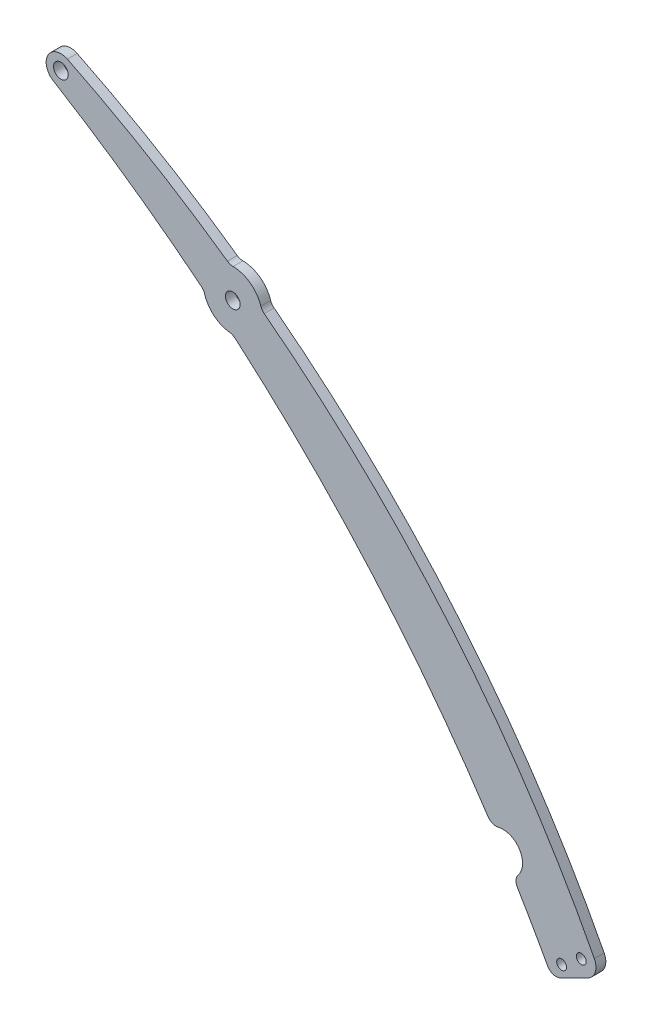
ISO-10303-21;
HEADER;
FILE_DESCRIPTION(('STEP AP214'),'2;1');
FILE_NAME('part.step','',(''),(''),'','','');
FILE_SCHEMA(('AUTOMOTIVE_DESIGN { 1 0 10303 214 1 1 1 1 }'));
ENDSEC;
DATA;
#1=APPLICATION_CONTEXT('core data for automotive mechanical design processes');
#2=APPLICATION_PROTOCOL_DEFINITION('international standard','automotive_design',2000,#1);
#3=PRODUCT_CONTEXT('',#1,'mechanical');
#4=PRODUCT('Part','Part','',(#3));
#5=PRODUCT_RELATED_PRODUCT_CATEGORY('part','',(#4));
#6=PRODUCT_DEFINITION_FORMATION('','',#4);
#7=PRODUCT_DEFINITION_CONTEXT('part definition',#1,'design');
#8=PRODUCT_DEFINITION('design','',#6,#7);
#9=PRODUCT_DEFINITION_SHAPE('','',#8);
#10=(LENGTH_UNIT() NAMED_UNIT(*) SI_UNIT(.MILLI.,.METRE.));
#11=(NAMED_UNIT(*) PLANE_ANGLE_UNIT() SI_UNIT($,.RADIAN.));
#12=(NAMED_UNIT(*) SI_UNIT($,.STERADIAN.) SOLID_ANGLE_UNIT());
#13=UNCERTAINTY_MEASURE_WITH_UNIT(LENGTH_MEASURE(1.E-05),#10,'distance_accuracy_value','');
#14=(GEOMETRIC_REPRESENTATION_CONTEXT(3) GLOBAL_UNCERTAINTY_ASSIGNED_CONTEXT((#13)) GLOBAL_UNIT_ASSIGNED_CONTEXT((#10,
#11,#12)) REPRESENTATION_CONTEXT('',''));
#15=CARTESIAN_POINT('',(0.,0.,0.));
#16=DIRECTION('',(0.,0.,1.));
#17=DIRECTION('',(1.,0.,0.));
#18=AXIS2_PLACEMENT_3D('',#15,#16,#17);
#19=CARTESIAN_POINT('',(-104.441646141028,-212.746192801075,2.));
#20=DIRECTION('',(0.,0.,-1.));
#21=DIRECTION('',(-1.,0.,0.));
#22=AXIS2_PLACEMENT_3D('',#19,#20,#21);
#23=PLANE('',#22);
#24=CARTESIAN_POINT('',(-104.441646141028,-212.746192801075,2.));
#25=DIRECTION('',(0.,0.,1.));
#26=DIRECTION('',(-1.,0.,0.));
#27=AXIS2_PLACEMENT_3D('',#24,#25,#26);
#28=CIRCLE('',#27,240.);
#29=CARTESIAN_POINT('',(33.906457746994,-16.6344844545589,2.));
#30=VERTEX_POINT('',#29);
#31=CARTESIAN_POINT('',(1.32204615368389,2.69298978229209,2.));
#32=VERTEX_POINT('',#31);
#33=EDGE_CURVE('E232',#30,#32,#28,.T.);
#34=ORIENTED_EDGE('',*,*,#33,.T.);
#35=CARTESIAN_POINT('',(0.,0.,2.));
#36=DIRECTION('',(0.,0.,1.));
#37=DIRECTION('',(1.,0.,0.));
#38=AXIS2_PLACEMENT_3D('',#35,#36,#37);
#39=CIRCLE('',#38,3.);
#40=CARTESIAN_POINT('',(-1.55871058061747,-2.56328330971649,2.));
#41=VERTEX_POINT('',#40);
#42=EDGE_CURVE('E133',#32,#41,#39,.T.);
#43=ORIENTED_EDGE('',*,*,#42,.T.);
#44=CARTESIAN_POINT('',(-147.038364771582,-241.803058883256,2.));
#45=DIRECTION('',(0.,0.,-1.));
#46=DIRECTION('',(-1.,0.,0.));
#47=AXIS2_PLACEMENT_3D('',#44,#45,#46);
#48=CIRCLE('',#47,280.);
#49=CARTESIAN_POINT('',(28.589143834394,-23.7320194927445,2.));
#50=VERTEX_POINT('',#49);
#51=EDGE_CURVE('E279',#41,#50,#48,.T.);
#52=ORIENTED_EDGE('',*,*,#51,.T.);
#53=CARTESIAN_POINT('',(27.3346616300656,-25.2896697741052,2.));
#54=DIRECTION('',(0.,0.,-1.));
#55=DIRECTION('',(-1.,0.,0.));
#56=AXIS2_PLACEMENT_3D('',#53,#54,#55);
#57=CIRCLE('',#56,2.);
#58=CARTESIAN_POINT('',(29.2509962225486,-24.7172523305791,2.));
#59=VERTEX_POINT('',#58);
#60=EDGE_CURVE('E299',#50,#59,#57,.T.);
#61=ORIENTED_EDGE('',*,*,#60,.T.);
#62=CARTESIAN_POINT('',(35.,-23.,2.));
#63=DIRECTION('',(0.,0.,1.));
#64=DIRECTION('',(1.,0.,0.));
#65=AXIS2_PLACEMENT_3D('',#62,#63,#64);
#66=CIRCLE('',#65,6.00000000000246);
#67=CARTESIAN_POINT('',(34.3571848035066,-28.9654663374448,2.));
#68=VERTEX_POINT('',#67);
#69=EDGE_CURVE('E294',#59,#68,#66,.T.);
#70=ORIENTED_EDGE('',*,*,#69,.T.);
#71=CARTESIAN_POINT('',(34.1429130713422,-30.9539551165922,2.));
#72=DIRECTION('',(0.,0.,-1.));
#73=DIRECTION('',(1.,0.,0.));
#74=AXIS2_PLACEMENT_3D('',#71,#72,#73);
#75=CIRCLE('',#74,2.);
#76=CARTESIAN_POINT('',(35.4463755018668,-29.4370550894939,2.));
#77=VERTEX_POINT('',#76);
#78=EDGE_CURVE('E298',#68,#77,#75,.T.);
#79=ORIENTED_EDGE('',*,*,#78,.T.);
#80=CARTESIAN_POINT('',(-147.038364771582,-241.803058883256,2.));
#81=DIRECTION('',(0.,0.,-1.));
#82=DIRECTION('',(-1.,0.,0.));
#83=AXIS2_PLACEMENT_3D('',#80,#81,#82);
#84=CIRCLE('',#83,280.);
#85=CARTESIAN_POINT('',(86.9517610214961,-88.0219773701524,2.));
#86=VERTEX_POINT('',#85);
#87=EDGE_CURVE('E300',#77,#86,#84,.T.);
#88=ORIENTED_EDGE('',*,*,#87,.T.);
#89=CARTESIAN_POINT('',(88.6231190628752,-86.9235410736303,2.));
#90=DIRECTION('',(0.,0.,1.));
#91=DIRECTION('',(-1.,0.,0.));
#92=AXIS2_PLACEMENT_3D('',#89,#90,#91);
#93=CIRCLE('',#92,2.);
#94=CARTESIAN_POINT('',(89.0820793752501,-88.8701677537271,2.));
#95=VERTEX_POINT('',#94);
#96=EDGE_CURVE('E304',#86,#95,#93,.T.);
#97=ORIENTED_EDGE('',*,*,#96,.T.);
#98=CARTESIAN_POINT('',(90.,-92.7634211139207,2.));
#99=DIRECTION('',(0.,0.,-1.));
#100=DIRECTION('',(-1.,0.,0.));
#101=AXIS2_PLACEMENT_3D('',#98,#99,#100);
#102=CIRCLE('',#101,3.99999999999999);
#103=CARTESIAN_POINT('',(93.1109286253578,-95.2778043559762,2.));
#104=VERTEX_POINT('',#103);
#105=EDGE_CURVE('E307',#95,#104,#102,.T.);
#106=ORIENTED_EDGE('',*,*,#105,.T.);
#107=CARTESIAN_POINT('',(94.6663929380367,-96.5349959770039,2.));
#108=DIRECTION('',(0.,0.,1.));
#109=DIRECTION('',(1.,0.,0.));
#110=AXIS2_PLACEMENT_3D('',#107,#108,#109);
#111=CIRCLE('',#110,2.);
#112=CARTESIAN_POINT('',(92.9521747982521,-97.5652659266937,2.));
#113=VERTEX_POINT('',#112);
#114=EDGE_CURVE('E310',#104,#113,#111,.T.);
#115=ORIENTED_EDGE('',*,*,#114,.T.);
#116=CARTESIAN_POINT('',(-147.038364771582,-241.803058883256,2.));
#117=DIRECTION('',(0.,0.,-1.));
#118=DIRECTION('',(-1.,0.,0.));
#119=AXIS2_PLACEMENT_3D('',#116,#117,#118);
#120=CIRCLE('',#119,280.);
#121=CARTESIAN_POINT('',(99.0817764541614,-108.293223728611,2.));
#122=VERTEX_POINT('',#121);
#123=EDGE_CURVE('E313',#113,#122,#120,.T.);
#124=ORIENTED_EDGE('',*,*,#123,.T.);
#125=CARTESIAN_POINT('',(100.839777462917,-107.339582048935,2.));
#126=DIRECTION('',(0.,0.,1.));
#127=DIRECTION('',(1.,0.,0.));
#128=AXIS2_PLACEMENT_3D('',#125,#126,#127);
#129=CIRCLE('',#128,1.99999999999999);
#130=CARTESIAN_POINT('',(101.737876551127,-109.126595766777,2.));
#131=VERTEX_POINT('',#130);
#132=EDGE_CURVE('E311',#122,#131,#129,.T.);
#133=ORIENTED_EDGE('',*,*,#132,.T.);
#134=DIRECTION('',(0.893506858920948,0.449049544105348,0.));
#135=VECTOR('',#134,1.);
#136=CARTESIAN_POINT('',(107.302513423485,-106.329977446844,2.));
#137=LINE('',#136,#135);
#138=CARTESIAN_POINT('',(107.302513423485,-106.329977446844,2.));
#139=VERTEX_POINT('',#138);
#140=EDGE_CURVE('E312',#131,#139,#137,.T.);
#141=ORIENTED_EDGE('',*,*,#140,.T.);
#142=CARTESIAN_POINT('',(105.955364791169,-103.649456870081,2.));
#143=DIRECTION('',(0.,0.,1.));
#144=DIRECTION('',(-1.,0.,0.));
#145=AXIS2_PLACEMENT_3D('',#142,#143,#144);
#146=CIRCLE('',#145,2.99999999999999);
#147=CARTESIAN_POINT('',(108.618618094108,-102.268485529183,2.));
#148=VERTEX_POINT('',#147);
#149=EDGE_CURVE('E320',#139,#148,#146,.T.);
#150=ORIENTED_EDGE('',*,*,#149,.T.);
#151=CARTESIAN_POINT('',(-104.441646141028,-212.746192801075,2.));
#152=DIRECTION('',(0.,0.,1.));
#153=DIRECTION('',(-1.,0.,0.));
#154=AXIS2_PLACEMENT_3D('',#151,#152,#153);
#155=CIRCLE('',#154,240.);
#156=CARTESIAN_POINT('',(41.4015934450764,-22.1425478542113,2.));
#157=VERTEX_POINT('',#156);
#158=EDGE_CURVE('E179',#148,#157,#155,.T.);
#159=ORIENTED_EDGE('',*,*,#158,.T.);
#160=CARTESIAN_POINT('',(42.6169537749606,-20.5541841463207,2.));
#161=DIRECTION('',(0.,0.,-1.));
#162=DIRECTION('',(-1.,0.,0.));
#163=AXIS2_PLACEMENT_3D('',#160,#161,#162);
#164=CIRCLE('',#163,2.);
#165=CARTESIAN_POINT('',(40.7127153312204,-21.1656381097406,2.));
#166=VERTEX_POINT('',#165);
#167=EDGE_CURVE('E175',#157,#166,#164,.T.);
#168=ORIENTED_EDGE('',*,*,#167,.T.);
#169=CARTESIAN_POINT('',(35.,-23.,2.));
#170=DIRECTION('',(0.,0.,1.));
#171=DIRECTION('',(1.,0.,0.));
#172=AXIS2_PLACEMENT_3D('',#169,#170,#171);
#173=CIRCLE('',#172,5.99999999999969);
#174=CARTESIAN_POINT('',(35.0445189595456,-17.0001651637535,2.));
#175=VERTEX_POINT('',#174);
#176=EDGE_CURVE('E177',#166,#175,#173,.T.);
#177=ORIENTED_EDGE('',*,*,#176,.T.);
#178=CARTESIAN_POINT('',(35.0593586127275,-15.0002202183379,2.));
#179=DIRECTION('',(0.,0.,-1.));
#180=DIRECTION('',(1.,0.,0.));
#181=AXIS2_PLACEMENT_3D('',#178,#179,#180);
#182=CIRCLE('',#181,2.);
#183=EDGE_CURVE('E59',#175,#30,#182,.T.);
#184=ORIENTED_EDGE('',*,*,#183,.T.);
#185=EDGE_LOOP('',(#34,#43,#52,#61,#70,#79,#88,#97,#106,#115,#124,#133,#141,#150,#159,#168,#177,#184));
#186=FACE_BOUND('',#185,.T.);
#187=CARTESIAN_POINT('',(0.,0.,2.));
#188=DIRECTION('',(0.,0.,1.));
#189=DIRECTION('',(1.,0.,0.));
#190=AXIS2_PLACEMENT_3D('',#187,#188,#189);
#191=CIRCLE('',#190,1.5);
#192=CARTESIAN_POINT('',(1.5,0.,2.));
#193=VERTEX_POINT('',#192);
#194=EDGE_CURVE('E205',#193,#193,#191,.T.);
#195=ORIENTED_EDGE('',*,*,#194,.F.);
#196=EDGE_LOOP('',(#195));
#197=FACE_BOUND('',#196,.T.);
#198=CARTESIAN_POINT('',(101.955364791169,-106.649456870081,2.));
#199=DIRECTION('',(0.,0.,1.));
#200=DIRECTION('',(1.,0.,0.));
#201=AXIS2_PLACEMENT_3D('',#198,#199,#200);
#202=CIRCLE('',#201,0.999999999999998);
#203=CARTESIAN_POINT('',(102.955364791169,-106.649456870081,2.));
#204=VERTEX_POINT('',#203);
#205=EDGE_CURVE('E381',#204,#204,#202,.T.);
#206=ORIENTED_EDGE('',*,*,#205,.F.);
#207=EDGE_LOOP('',(#206));
#208=FACE_BOUND('',#207,.T.);
#209=CARTESIAN_POINT('',(35.,-23.,2.));
#210=DIRECTION('',(0.,0.,1.));
#211=DIRECTION('',(1.,0.,0.));
#212=AXIS2_PLACEMENT_3D('',#209,#210,#211);
#213=CIRCLE('',#212,1.5);
#214=CARTESIAN_POINT('',(36.5,-23.,2.));
#215=VERTEX_POINT('',#214);
#216=EDGE_CURVE('E374',#215,#215,#213,.T.);
#217=ORIENTED_EDGE('',*,*,#216,.F.);
#218=EDGE_LOOP('',(#217));
#219=FACE_BOUND('',#218,.T.);
#220=CARTESIAN_POINT('',(105.955364791169,-103.649456870081,2.));
#221=DIRECTION('',(0.,0.,1.));
#222=DIRECTION('',(1.,0.,0.));
#223=AXIS2_PLACEMENT_3D('',#220,#221,#222);
#224=CIRCLE('',#223,0.999999999999998);
#225=CARTESIAN_POINT('',(106.955364791169,-103.649456870081,2.));
#226=VERTEX_POINT('',#225);
#227=EDGE_CURVE('E368',#226,#226,#224,.T.);
#228=ORIENTED_EDGE('',*,*,#227,.F.);
#229=EDGE_LOOP('',(#228));
#230=FACE_BOUND('',#229,.T.);
#231=ADVANCED_FACE('F41',(#186,#197,#208,#219,#230),#23,.F.);
#232=CARTESIAN_POINT('',(-104.441646141028,-212.746192801075,0.));
#233=DIRECTION('',(0.,0.,-1.));
#234=DIRECTION('',(-1.,0.,0.));
#235=AXIS2_PLACEMENT_3D('',#232,#233,#234);
#236=PLANE('',#235);
#237=CARTESIAN_POINT('',(35.,-23.,0.));
#238=DIRECTION('',(0.,0.,1.));
#239=DIRECTION('',(1.,0.,0.));
#240=AXIS2_PLACEMENT_3D('',#237,#238,#239);
#241=CIRCLE('',#240,1.5);
#242=CARTESIAN_POINT('',(36.5,-23.,0.));
#243=VERTEX_POINT('',#242);
#244=EDGE_CURVE('E375',#243,#243,#241,.T.);
#245=ORIENTED_EDGE('',*,*,#244,.T.);
#246=EDGE_LOOP('',(#245));
#247=FACE_BOUND('',#246,.T.);
#248=CARTESIAN_POINT('',(0.,0.,0.));
#249=DIRECTION('',(0.,0.,1.));
#250=DIRECTION('',(1.,0.,0.));
#251=AXIS2_PLACEMENT_3D('',#248,#249,#250);
#252=CIRCLE('',#251,1.5);
#253=CARTESIAN_POINT('',(1.5,0.,0.));
#254=VERTEX_POINT('',#253);
#255=EDGE_CURVE('E383',#254,#254,#252,.T.);
#256=ORIENTED_EDGE('',*,*,#255,.T.);
#257=EDGE_LOOP('',(#256));
#258=FACE_BOUND('',#257,.T.);
#259=CARTESIAN_POINT('',(-104.441646141028,-212.746192801075,0.));
#260=DIRECTION('',(0.,0.,1.));
#261=DIRECTION('',(-1.,0.,0.));
#262=AXIS2_PLACEMENT_3D('',#259,#260,#261);
#263=CIRCLE('',#262,240.);
#264=CARTESIAN_POINT('',(33.906457746994,-16.6344844545589,0.));
#265=VERTEX_POINT('',#264);
#266=CARTESIAN_POINT('',(1.32204615368389,2.69298978229209,0.));
#267=VERTEX_POINT('',#266);
#268=EDGE_CURVE('E196',#265,#267,#263,.T.);
#269=ORIENTED_EDGE('',*,*,#268,.F.);
#270=CARTESIAN_POINT('',(35.0593586127275,-15.0002202183379,0.));
#271=DIRECTION('',(0.,0.,-1.));
#272=DIRECTION('',(1.,0.,0.));
#273=AXIS2_PLACEMENT_3D('',#270,#271,#272);
#274=CIRCLE('',#273,2.);
#275=CARTESIAN_POINT('',(35.0445189595456,-17.0001651637535,0.));
#276=VERTEX_POINT('',#275);
#277=EDGE_CURVE('E122',#276,#265,#274,.T.);
#278=ORIENTED_EDGE('',*,*,#277,.F.);
#279=CARTESIAN_POINT('',(35.,-23.,0.));
#280=DIRECTION('',(0.,0.,1.));
#281=DIRECTION('',(1.,0.,0.));
#282=AXIS2_PLACEMENT_3D('',#279,#280,#281);
#283=CIRCLE('',#282,5.99999999999969);
#284=CARTESIAN_POINT('',(40.7127153312204,-21.1656381097406,0.));
#285=VERTEX_POINT('',#284);
#286=EDGE_CURVE('E119',#285,#276,#283,.T.);
#287=ORIENTED_EDGE('',*,*,#286,.F.);
#288=CARTESIAN_POINT('',(42.6169537749606,-20.5541841463207,0.));
#289=DIRECTION('',(0.,0.,-1.));
#290=DIRECTION('',(-1.,0.,0.));
#291=AXIS2_PLACEMENT_3D('',#288,#289,#290);
#292=CIRCLE('',#291,2.);
#293=CARTESIAN_POINT('',(41.4015934450764,-22.1425478542113,0.));
#294=VERTEX_POINT('',#293);
#295=EDGE_CURVE('E187',#294,#285,#292,.T.);
#296=ORIENTED_EDGE('',*,*,#295,.F.);
#297=CARTESIAN_POINT('',(-104.441646141028,-212.746192801075,0.));
#298=DIRECTION('',(0.,0.,1.));
#299=DIRECTION('',(-1.,0.,0.));
#300=AXIS2_PLACEMENT_3D('',#297,#298,#299);
#301=CIRCLE('',#300,240.);
#302=CARTESIAN_POINT('',(108.618618094108,-102.268485529183,0.));
#303=VERTEX_POINT('',#302);
#304=EDGE_CURVE('E227',#303,#294,#301,.T.);
#305=ORIENTED_EDGE('',*,*,#304,.F.);
#306=CARTESIAN_POINT('',(105.955364791169,-103.649456870081,0.));
#307=DIRECTION('',(0.,0.,1.));
#308=DIRECTION('',(-1.,0.,0.));
#309=AXIS2_PLACEMENT_3D('',#306,#307,#308);
#310=CIRCLE('',#309,2.99999999999999);
#311=CARTESIAN_POINT('',(107.302513423485,-106.329977446844,0.));
#312=VERTEX_POINT('',#311);
#313=EDGE_CURVE('E228',#312,#303,#310,.T.);
#314=ORIENTED_EDGE('',*,*,#313,.F.);
#315=DIRECTION('',(0.893506858920948,0.449049544105348,0.));
#316=VECTOR('',#315,1.);
#317=CARTESIAN_POINT('',(107.302513423485,-106.329977446844,0.));
#318=LINE('',#317,#316);
#319=CARTESIAN_POINT('',(101.737876551127,-109.126595766777,0.));
#320=VERTEX_POINT('',#319);
#321=EDGE_CURVE('E221',#320,#312,#318,.T.);
#322=ORIENTED_EDGE('',*,*,#321,.F.);
#323=CARTESIAN_POINT('',(100.839777462917,-107.339582048935,0.));
#324=DIRECTION('',(0.,0.,1.));
#325=DIRECTION('',(1.,0.,0.));
#326=AXIS2_PLACEMENT_3D('',#323,#324,#325);
#327=CIRCLE('',#326,1.99999999999999);
#328=CARTESIAN_POINT('',(99.0817764541614,-108.293223728611,0.));
#329=VERTEX_POINT('',#328);
#330=EDGE_CURVE('E225',#329,#320,#327,.T.);
#331=ORIENTED_EDGE('',*,*,#330,.F.);
#332=CARTESIAN_POINT('',(-147.038364771582,-241.803058883256,0.));
#333=DIRECTION('',(0.,0.,-1.));
#334=DIRECTION('',(-1.,0.,0.));
#335=AXIS2_PLACEMENT_3D('',#332,#333,#334);
#336=CIRCLE('',#335,280.);
#337=CARTESIAN_POINT('',(92.9521747982521,-97.5652659266937,0.));
#338=VERTEX_POINT('',#337);
#339=EDGE_CURVE('E219',#338,#329,#336,.T.);
#340=ORIENTED_EDGE('',*,*,#339,.F.);
#341=CARTESIAN_POINT('',(94.6663929380367,-96.5349959770039,0.));
#342=DIRECTION('',(0.,0.,1.));
#343=DIRECTION('',(1.,0.,0.));
#344=AXIS2_PLACEMENT_3D('',#341,#342,#343);
#345=CIRCLE('',#344,2.);
#346=CARTESIAN_POINT('',(93.1109286253578,-95.2778043559762,0.));
#347=VERTEX_POINT('',#346);
#348=EDGE_CURVE('E217',#347,#338,#345,.T.);
#349=ORIENTED_EDGE('',*,*,#348,.F.);
#350=CARTESIAN_POINT('',(90.,-92.7634211139207,0.));
#351=DIRECTION('',(0.,0.,-1.));
#352=DIRECTION('',(-1.,0.,0.));
#353=AXIS2_PLACEMENT_3D('',#350,#351,#352);
#354=CIRCLE('',#353,3.99999999999999);
#355=CARTESIAN_POINT('',(89.0820793752501,-88.8701677537271,0.));
#356=VERTEX_POINT('',#355);
#357=EDGE_CURVE('E216',#356,#347,#354,.T.);
#358=ORIENTED_EDGE('',*,*,#357,.F.);
#359=CARTESIAN_POINT('',(88.6231190628752,-86.9235410736303,0.));
#360=DIRECTION('',(0.,0.,1.));
#361=DIRECTION('',(-1.,0.,0.));
#362=AXIS2_PLACEMENT_3D('',#359,#360,#361);
#363=CIRCLE('',#362,2.);
#364=CARTESIAN_POINT('',(86.9517610214961,-88.0219773701524,0.));
#365=VERTEX_POINT('',#364);
#366=EDGE_CURVE('E212',#365,#356,#363,.T.);
#367=ORIENTED_EDGE('',*,*,#366,.F.);
#368=CARTESIAN_POINT('',(-147.038364771582,-241.803058883256,0.));
#369=DIRECTION('',(0.,0.,-1.));
#370=DIRECTION('',(-1.,0.,0.));
#371=AXIS2_PLACEMENT_3D('',#368,#369,#370);
#372=CIRCLE('',#371,280.);
#373=CARTESIAN_POINT('',(35.4463755018668,-29.4370550894939,0.));
#374=VERTEX_POINT('',#373);
#375=EDGE_CURVE('E215',#374,#365,#372,.T.);
#376=ORIENTED_EDGE('',*,*,#375,.F.);
#377=CARTESIAN_POINT('',(34.1429130713422,-30.9539551165922,0.));
#378=DIRECTION('',(0.,0.,-1.));
#379=DIRECTION('',(1.,0.,0.));
#380=AXIS2_PLACEMENT_3D('',#377,#378,#379);
#381=CIRCLE('',#380,2.);
#382=CARTESIAN_POINT('',(34.3571848035066,-28.9654663374448,0.));
#383=VERTEX_POINT('',#382);
#384=EDGE_CURVE('E209',#383,#374,#381,.T.);
#385=ORIENTED_EDGE('',*,*,#384,.F.);
#386=CARTESIAN_POINT('',(35.,-23.,0.));
#387=DIRECTION('',(0.,0.,1.));
#388=DIRECTION('',(1.,0.,0.));
#389=AXIS2_PLACEMENT_3D('',#386,#387,#388);
#390=CIRCLE('',#389,6.00000000000246);
#391=CARTESIAN_POINT('',(29.2509962225486,-24.7172523305791,0.));
#392=VERTEX_POINT('',#391);
#393=EDGE_CURVE('E208',#392,#383,#390,.T.);
#394=ORIENTED_EDGE('',*,*,#393,.F.);
#395=CARTESIAN_POINT('',(27.3346616300656,-25.2896697741052,0.));
#396=DIRECTION('',(0.,0.,-1.));
#397=DIRECTION('',(-1.,0.,0.));
#398=AXIS2_PLACEMENT_3D('',#395,#396,#397);
#399=CIRCLE('',#398,2.);
#400=CARTESIAN_POINT('',(28.589143834394,-23.7320194927445,0.));
#401=VERTEX_POINT('',#400);
#402=EDGE_CURVE('E206',#401,#392,#399,.T.);
#403=ORIENTED_EDGE('',*,*,#402,.F.);
#404=CARTESIAN_POINT('',(-147.038364771582,-241.803058883256,0.));
#405=DIRECTION('',(0.,0.,-1.));
#406=DIRECTION('',(-1.,0.,0.));
#407=AXIS2_PLACEMENT_3D('',#404,#405,#406);
#408=CIRCLE('',#407,280.);
#409=CARTESIAN_POINT('',(-1.55871058061747,-2.56328330971649,0.));
#410=VERTEX_POINT('',#409);
#411=EDGE_CURVE('E204',#410,#401,#408,.T.);
#412=ORIENTED_EDGE('',*,*,#411,.F.);
#413=CARTESIAN_POINT('',(0.,0.,0.));
#414=DIRECTION('',(0.,0.,1.));
#415=DIRECTION('',(1.,0.,0.));
#416=AXIS2_PLACEMENT_3D('',#413,#414,#415);
#417=CIRCLE('',#416,3.);
#418=EDGE_CURVE('E203',#267,#410,#417,.T.);
#419=ORIENTED_EDGE('',*,*,#418,.F.);
#420=EDGE_LOOP('',(#269,#278,#287,#296,#305,#314,#322,#331,#340,#349,#358,#367,#376,#385,#394,
#403,#412,#419));
#421=FACE_BOUND('',#420,.T.);
#422=CARTESIAN_POINT('',(101.955364791169,-106.649456870081,0.));
#423=DIRECTION('',(0.,0.,1.));
#424=DIRECTION('',(1.,0.,0.));
#425=AXIS2_PLACEMENT_3D('',#422,#423,#424);
#426=CIRCLE('',#425,0.999999999999998);
#427=CARTESIAN_POINT('',(102.955364791169,-106.649456870081,0.));
#428=VERTEX_POINT('',#427);
#429=EDGE_CURVE('E378',#428,#428,#426,.T.);
#430=ORIENTED_EDGE('',*,*,#429,.T.);
#431=EDGE_LOOP('',(#430));
#432=FACE_BOUND('',#431,.T.);
#433=CARTESIAN_POINT('',(105.955364791169,-103.649456870081,0.));
#434=DIRECTION('',(0.,0.,1.));
#435=DIRECTION('',(1.,0.,0.));
#436=AXIS2_PLACEMENT_3D('',#433,#434,#435);
#437=CIRCLE('',#436,0.999999999999998);
#438=CARTESIAN_POINT('',(106.955364791169,-103.649456870081,0.));
#439=VERTEX_POINT('',#438);
#440=EDGE_CURVE('E369',#439,#439,#437,.T.);
#441=ORIENTED_EDGE('',*,*,#440,.T.);
#442=EDGE_LOOP('',(#441));
#443=FACE_BOUND('',#442,.T.);
#444=ADVANCED_FACE('F284',(#247,#258,#421,#432,#443),#236,.T.);
#445=CARTESIAN_POINT('',(-104.441646141028,-212.746192801075,2.));
#446=DIRECTION('',(0.,0.,-1.));
#447=DIRECTION('',(-1.,0.,0.));
#448=AXIS2_PLACEMENT_3D('',#445,#446,#447);
#449=CYLINDRICAL_SURFACE('',#448,240.);
#450=ORIENTED_EDGE('',*,*,#268,.T.);
#451=DIRECTION('',(0.,0.,-1.));
#452=VECTOR('',#451,1.);
#453=CARTESIAN_POINT('',(1.32204615368389,2.69298978229209,2.));
#454=LINE('',#453,#452);
#455=EDGE_CURVE('E11',#32,#267,#454,.T.);
#456=ORIENTED_EDGE('',*,*,#455,.F.);
#457=ORIENTED_EDGE('',*,*,#33,.F.);
#458=DIRECTION('',(0.,0.,-1.));
#459=VECTOR('',#458,1.);
#460=CARTESIAN_POINT('',(33.906457746994,-16.6344844545589,2.));
#461=LINE('',#460,#459);
#462=EDGE_CURVE('E193',#30,#265,#461,.T.);
#463=ORIENTED_EDGE('',*,*,#462,.T.);
#464=EDGE_LOOP('',(#450,#456,#457,#463));
#465=FACE_BOUND('',#464,.T.);
#466=ADVANCED_FACE('F43',(#465),#449,.T.);
#467=CARTESIAN_POINT('',(0.,0.,2.));
#468=DIRECTION('',(0.,0.,-1.));
#469=DIRECTION('',(-1.,0.,0.));
#470=AXIS2_PLACEMENT_3D('',#467,#468,#469);
#471=CYLINDRICAL_SURFACE('',#470,3.);
#472=ORIENTED_EDGE('',*,*,#418,.T.);
#473=DIRECTION('',(0.,0.,-1.));
#474=VECTOR('',#473,1.);
#475=CARTESIAN_POINT('',(-1.55871058061747,-2.56328330971649,2.));
#476=LINE('',#475,#474);
#477=EDGE_CURVE('E49',#41,#410,#476,.T.);
#478=ORIENTED_EDGE('',*,*,#477,.F.);
#479=ORIENTED_EDGE('',*,*,#42,.F.);
#480=ORIENTED_EDGE('',*,*,#455,.T.);
#481=EDGE_LOOP('',(#472,#478,#479,#480));
#482=FACE_BOUND('',#481,.T.);
#483=ADVANCED_FACE('F556',(#482),#471,.T.);
#484=CARTESIAN_POINT('',(-147.038364771582,-241.803058883256,2.));
#485=DIRECTION('',(0.,0.,-1.));
#486=DIRECTION('',(-1.,0.,0.));
#487=AXIS2_PLACEMENT_3D('',#484,#485,#486);
#488=CYLINDRICAL_SURFACE('',#487,280.);
#489=ORIENTED_EDGE('',*,*,#411,.T.);
#490=DIRECTION('',(0.,0.,-1.));
#491=VECTOR('',#490,1.);
#492=CARTESIAN_POINT('',(28.589143834394,-23.7320194927445,2.));
#493=LINE('',#492,#491);
#494=EDGE_CURVE('E269',#50,#401,#493,.T.);
#495=ORIENTED_EDGE('',*,*,#494,.F.);
#496=ORIENTED_EDGE('',*,*,#51,.F.);
#497=ORIENTED_EDGE('',*,*,#477,.T.);
#498=EDGE_LOOP('',(#489,#495,#496,#497));
#499=FACE_BOUND('',#498,.T.);
#500=ADVANCED_FACE('F277',(#499),#488,.F.);
#501=CARTESIAN_POINT('',(27.3346616300656,-25.2896697741052,2.));
#502=DIRECTION('',(0.,0.,-1.));
#503=DIRECTION('',(-1.,0.,0.));
#504=AXIS2_PLACEMENT_3D('',#501,#502,#503);
#505=CYLINDRICAL_SURFACE('',#504,2.);
#506=ORIENTED_EDGE('',*,*,#402,.T.);
#507=DIRECTION('',(0.,0.,-1.));
#508=VECTOR('',#507,1.);
#509=CARTESIAN_POINT('',(29.2509962225486,-24.7172523305791,2.));
#510=LINE('',#509,#508);
#511=EDGE_CURVE('E270',#59,#392,#510,.T.);
#512=ORIENTED_EDGE('',*,*,#511,.F.);
#513=ORIENTED_EDGE('',*,*,#60,.F.);
#514=ORIENTED_EDGE('',*,*,#494,.T.);
#515=EDGE_LOOP('',(#506,#512,#513,#514));
#516=FACE_BOUND('',#515,.T.);
#517=ADVANCED_FACE('F287',(#516),#505,.F.);
#518=CARTESIAN_POINT('',(35.,-23.,2.));
#519=DIRECTION('',(0.,0.,-1.));
#520=DIRECTION('',(-1.,0.,0.));
#521=AXIS2_PLACEMENT_3D('',#518,#519,#520);
#522=CYLINDRICAL_SURFACE('',#521,6.00000000000246);
#523=ORIENTED_EDGE('',*,*,#393,.T.);
#524=DIRECTION('',(0.,0.,-1.));
#525=VECTOR('',#524,1.);
#526=CARTESIAN_POINT('',(34.3571848035066,-28.9654663374448,2.));
#527=LINE('',#526,#525);
#528=EDGE_CURVE('E262',#68,#383,#527,.T.);
#529=ORIENTED_EDGE('',*,*,#528,.F.);
#530=ORIENTED_EDGE('',*,*,#69,.F.);
#531=ORIENTED_EDGE('',*,*,#511,.T.);
#532=EDGE_LOOP('',(#523,#529,#530,#531));
#533=FACE_BOUND('',#532,.T.);
#534=ADVANCED_FACE('F295',(#533),#522,.T.);
#535=CARTESIAN_POINT('',(34.1429130713422,-30.9539551165922,2.));
#536=DIRECTION('',(0.,0.,-1.));
#537=DIRECTION('',(-1.,0.,0.));
#538=AXIS2_PLACEMENT_3D('',#535,#536,#537);
#539=CYLINDRICAL_SURFACE('',#538,2.);
#540=ORIENTED_EDGE('',*,*,#384,.T.);
#541=DIRECTION('',(0.,0.,-1.));
#542=VECTOR('',#541,1.);
#543=CARTESIAN_POINT('',(35.4463755018668,-29.4370550894939,2.));
#544=LINE('',#543,#542);
#545=EDGE_CURVE('E261',#77,#374,#544,.T.);
#546=ORIENTED_EDGE('',*,*,#545,.F.);
#547=ORIENTED_EDGE('',*,*,#78,.F.);
#548=ORIENTED_EDGE('',*,*,#528,.T.);
#549=EDGE_LOOP('',(#540,#546,#547,#548));
#550=FACE_BOUND('',#549,.T.);
#551=ADVANCED_FACE('F524',(#550),#539,.F.);
#552=CARTESIAN_POINT('',(-147.038364771582,-241.803058883256,2.));
#553=DIRECTION('',(0.,0.,-1.));
#554=DIRECTION('',(-1.,0.,0.));
#555=AXIS2_PLACEMENT_3D('',#552,#553,#554);
#556=CYLINDRICAL_SURFACE('',#555,280.);
#557=ORIENTED_EDGE('',*,*,#375,.T.);
#558=DIRECTION('',(0.,0.,-1.));
#559=VECTOR('',#558,1.);
#560=CARTESIAN_POINT('',(86.9517610214961,-88.0219773701524,2.));
#561=LINE('',#560,#559);
#562=EDGE_CURVE('E256',#86,#365,#561,.T.);
#563=ORIENTED_EDGE('',*,*,#562,.F.);
#564=ORIENTED_EDGE('',*,*,#87,.F.);
#565=ORIENTED_EDGE('',*,*,#545,.T.);
#566=EDGE_LOOP('',(#557,#563,#564,#565));
#567=FACE_BOUND('',#566,.T.);
#568=ADVANCED_FACE('F513',(#567),#556,.F.);
#569=CARTESIAN_POINT('',(88.6231190628752,-86.9235410736303,2.));
#570=DIRECTION('',(0.,0.,-1.));
#571=DIRECTION('',(-1.,0.,0.));
#572=AXIS2_PLACEMENT_3D('',#569,#570,#571);
#573=CYLINDRICAL_SURFACE('',#572,2.);
#574=ORIENTED_EDGE('',*,*,#366,.T.);
#575=DIRECTION('',(0.,0.,-1.));
#576=VECTOR('',#575,1.);
#577=CARTESIAN_POINT('',(89.0820793752501,-88.8701677537271,2.));
#578=LINE('',#577,#576);
#579=EDGE_CURVE('E254',#95,#356,#578,.T.);
#580=ORIENTED_EDGE('',*,*,#579,.F.);
#581=ORIENTED_EDGE('',*,*,#96,.F.);
#582=ORIENTED_EDGE('',*,*,#562,.T.);
#583=EDGE_LOOP('',(#574,#580,#581,#582));
#584=FACE_BOUND('',#583,.T.);
#585=ADVANCED_FACE('F501',(#584),#573,.T.);
#586=CARTESIAN_POINT('',(90.,-92.7634211139207,2.));
#587=DIRECTION('',(0.,0.,-1.));
#588=DIRECTION('',(-1.,0.,0.));
#589=AXIS2_PLACEMENT_3D('',#586,#587,#588);
#590=CYLINDRICAL_SURFACE('',#589,3.99999999999999);
#591=ORIENTED_EDGE('',*,*,#357,.T.);
#592=DIRECTION('',(0.,0.,-1.));
#593=VECTOR('',#592,1.);
#594=CARTESIAN_POINT('',(93.1109286253578,-95.2778043559762,2.));
#595=LINE('',#594,#593);
#596=EDGE_CURVE('E252',#104,#347,#595,.T.);
#597=ORIENTED_EDGE('',*,*,#596,.F.);
#598=ORIENTED_EDGE('',*,*,#105,.F.);
#599=ORIENTED_EDGE('',*,*,#579,.T.);
#600=EDGE_LOOP('',(#591,#597,#598,#599));
#601=FACE_BOUND('',#600,.T.);
#602=ADVANCED_FACE('F494',(#601),#590,.F.);
#603=CARTESIAN_POINT('',(94.6663929380367,-96.5349959770039,2.));
#604=DIRECTION('',(0.,0.,-1.));
#605=DIRECTION('',(-1.,0.,0.));
#606=AXIS2_PLACEMENT_3D('',#603,#604,#605);
#607=CYLINDRICAL_SURFACE('',#606,2.);
#608=ORIENTED_EDGE('',*,*,#348,.T.);
#609=DIRECTION('',(0.,0.,-1.));
#610=VECTOR('',#609,1.);
#611=CARTESIAN_POINT('',(92.9521747982521,-97.5652659266937,2.));
#612=LINE('',#611,#610);
#613=EDGE_CURVE('E248',#113,#338,#612,.T.);
#614=ORIENTED_EDGE('',*,*,#613,.F.);
#615=ORIENTED_EDGE('',*,*,#114,.F.);
#616=ORIENTED_EDGE('',*,*,#596,.T.);
#617=EDGE_LOOP('',(#608,#614,#615,#616));
#618=FACE_BOUND('',#617,.T.);
#619=ADVANCED_FACE('F484',(#618),#607,.T.);
#620=CARTESIAN_POINT('',(-147.038364771582,-241.803058883256,2.));
#621=DIRECTION('',(0.,0.,-1.));
#622=DIRECTION('',(-1.,0.,0.));
#623=AXIS2_PLACEMENT_3D('',#620,#621,#622);
#624=CYLINDRICAL_SURFACE('',#623,280.);
#625=ORIENTED_EDGE('',*,*,#339,.T.);
#626=DIRECTION('',(0.,0.,-1.));
#627=VECTOR('',#626,1.);
#628=CARTESIAN_POINT('',(99.0817764541614,-108.293223728611,2.));
#629=LINE('',#628,#627);
#630=EDGE_CURVE('E246',#122,#329,#629,.T.);
#631=ORIENTED_EDGE('',*,*,#630,.F.);
#632=ORIENTED_EDGE('',*,*,#123,.F.);
#633=ORIENTED_EDGE('',*,*,#613,.T.);
#634=EDGE_LOOP('',(#625,#631,#632,#633));
#635=FACE_BOUND('',#634,.T.);
#636=ADVANCED_FACE('F474',(#635),#624,.F.);
#637=CARTESIAN_POINT('',(100.839777462917,-107.339582048935,2.));
#638=DIRECTION('',(0.,0.,-1.));
#639=DIRECTION('',(-1.,0.,0.));
#640=AXIS2_PLACEMENT_3D('',#637,#638,#639);
#641=CYLINDRICAL_SURFACE('',#640,1.99999999999999);
#642=ORIENTED_EDGE('',*,*,#330,.T.);
#643=DIRECTION('',(0.,0.,-1.));
#644=VECTOR('',#643,1.);
#645=CARTESIAN_POINT('',(101.737876551127,-109.126595766777,2.));
#646=LINE('',#645,#644);
#647=EDGE_CURVE('E242',#131,#320,#646,.T.);
#648=ORIENTED_EDGE('',*,*,#647,.F.);
#649=ORIENTED_EDGE('',*,*,#132,.F.);
#650=ORIENTED_EDGE('',*,*,#630,.T.);
#651=EDGE_LOOP('',(#642,#648,#649,#650));
#652=FACE_BOUND('',#651,.T.);
#653=ADVANCED_FACE('F461',(#652),#641,.T.);
#654=CARTESIAN_POINT('',(107.302513423485,-106.329977446844,2.));
#655=DIRECTION('',(-0.449049544105348,0.893506858920948,0.));
#656=DIRECTION('',(-0.893506858920948,-0.449049544105348,0.));
#657=AXIS2_PLACEMENT_3D('',#654,#655,#656);
#658=PLANE('',#657);
#659=ORIENTED_EDGE('',*,*,#321,.T.);
#660=DIRECTION('',(0.,0.,-1.));
#661=VECTOR('',#660,1.);
#662=CARTESIAN_POINT('',(107.302513423485,-106.329977446844,2.));
#663=LINE('',#662,#661);
#664=EDGE_CURVE('E238',#139,#312,#663,.T.);
#665=ORIENTED_EDGE('',*,*,#664,.F.);
#666=ORIENTED_EDGE('',*,*,#140,.F.);
#667=ORIENTED_EDGE('',*,*,#647,.T.);
#668=EDGE_LOOP('',(#659,#665,#666,#667));
#669=FACE_BOUND('',#668,.T.);
#670=ADVANCED_FACE('F457',(#669),#658,.F.);
#671=CARTESIAN_POINT('',(105.955364791169,-103.649456870081,2.));
#672=DIRECTION('',(0.,0.,-1.));
#673=DIRECTION('',(-1.,0.,0.));
#674=AXIS2_PLACEMENT_3D('',#671,#672,#673);
#675=CYLINDRICAL_SURFACE('',#674,2.99999999999999);
#676=ORIENTED_EDGE('',*,*,#313,.T.);
#677=DIRECTION('',(0.,0.,-1.));
#678=VECTOR('',#677,1.);
#679=CARTESIAN_POINT('',(108.618618094108,-102.268485529183,2.));
#680=LINE('',#679,#678);
#681=EDGE_CURVE('E240',#148,#303,#680,.T.);
#682=ORIENTED_EDGE('',*,*,#681,.F.);
#683=ORIENTED_EDGE('',*,*,#149,.F.);
#684=ORIENTED_EDGE('',*,*,#664,.T.);
#685=EDGE_LOOP('',(#676,#682,#683,#684));
#686=FACE_BOUND('',#685,.T.);
#687=ADVANCED_FACE('F323',(#686),#675,.T.);
#688=CARTESIAN_POINT('',(-104.441646141028,-212.746192801075,2.));
#689=DIRECTION('',(0.,0.,-1.));
#690=DIRECTION('',(-1.,0.,0.));
#691=AXIS2_PLACEMENT_3D('',#688,#689,#690);
#692=CYLINDRICAL_SURFACE('',#691,240.);
#693=ORIENTED_EDGE('',*,*,#304,.T.);
#694=DIRECTION('',(0.,0.,-1.));
#695=VECTOR('',#694,1.);
#696=CARTESIAN_POINT('',(41.4015934450764,-22.1425478542113,2.));
#697=LINE('',#696,#695);
#698=EDGE_CURVE('E190',#157,#294,#697,.T.);
#699=ORIENTED_EDGE('',*,*,#698,.F.);
#700=ORIENTED_EDGE('',*,*,#158,.F.);
#701=ORIENTED_EDGE('',*,*,#681,.T.);
#702=EDGE_LOOP('',(#693,#699,#700,#701));
#703=FACE_BOUND('',#702,.T.);
#704=ADVANCED_FACE('F330',(#703),#692,.T.);
#705=CARTESIAN_POINT('',(42.6169537749606,-20.5541841463207,2.));
#706=DIRECTION('',(0.,0.,-1.));
#707=DIRECTION('',(-1.,0.,0.));
#708=AXIS2_PLACEMENT_3D('',#705,#706,#707);
#709=CYLINDRICAL_SURFACE('',#708,2.);
#710=ORIENTED_EDGE('',*,*,#295,.T.);
#711=DIRECTION('',(0.,0.,-1.));
#712=VECTOR('',#711,1.);
#713=CARTESIAN_POINT('',(40.7127153312204,-21.1656381097406,2.));
#714=LINE('',#713,#712);
#715=EDGE_CURVE('E183',#166,#285,#714,.T.);
#716=ORIENTED_EDGE('',*,*,#715,.F.);
#717=ORIENTED_EDGE('',*,*,#167,.F.);
#718=ORIENTED_EDGE('',*,*,#698,.T.);
#719=EDGE_LOOP('',(#710,#716,#717,#718));
#720=FACE_BOUND('',#719,.T.);
#721=ADVANCED_FACE('F188',(#720),#709,.F.);
#722=CARTESIAN_POINT('',(35.,-23.,2.));
#723=DIRECTION('',(0.,0.,-1.));
#724=DIRECTION('',(-1.,0.,0.));
#725=AXIS2_PLACEMENT_3D('',#722,#723,#724);
#726=CYLINDRICAL_SURFACE('',#725,5.99999999999969);
#727=ORIENTED_EDGE('',*,*,#286,.T.);
#728=DIRECTION('',(0.,0.,-1.));
#729=VECTOR('',#728,1.);
#730=CARTESIAN_POINT('',(35.0445189595456,-17.0001651637535,2.));
#731=LINE('',#730,#729);
#732=EDGE_CURVE('E186',#175,#276,#731,.T.);
#733=ORIENTED_EDGE('',*,*,#732,.F.);
#734=ORIENTED_EDGE('',*,*,#176,.F.);
#735=ORIENTED_EDGE('',*,*,#715,.T.);
#736=EDGE_LOOP('',(#727,#733,#734,#735));
#737=FACE_BOUND('',#736,.T.);
#738=ADVANCED_FACE('F195',(#737),#726,.T.);
#739=CARTESIAN_POINT('',(35.0593586127275,-15.0002202183379,2.));
#740=DIRECTION('',(0.,0.,-1.));
#741=DIRECTION('',(-1.,0.,0.));
#742=AXIS2_PLACEMENT_3D('',#739,#740,#741);
#743=CYLINDRICAL_SURFACE('',#742,2.);
#744=ORIENTED_EDGE('',*,*,#277,.T.);
#745=ORIENTED_EDGE('',*,*,#462,.F.);
#746=ORIENTED_EDGE('',*,*,#183,.F.);
#747=ORIENTED_EDGE('',*,*,#732,.T.);
#748=EDGE_LOOP('',(#744,#745,#746,#747));
#749=FACE_BOUND('',#748,.T.);
#750=ADVANCED_FACE('F332',(#749),#743,.F.);
#751=CARTESIAN_POINT('',(0.,0.,2.));
#752=DIRECTION('',(0.,0.,-1.));
#753=DIRECTION('',(-1.,0.,0.));
#754=AXIS2_PLACEMENT_3D('',#751,#752,#753);
#755=CYLINDRICAL_SURFACE('',#754,1.5);
#756=ORIENTED_EDGE('',*,*,#194,.T.);
#757=EDGE_LOOP('',(#756));
#758=FACE_BOUND('',#757,.T.);
#759=ORIENTED_EDGE('',*,*,#255,.F.);
#760=EDGE_LOOP('',(#759));
#761=FACE_BOUND('',#760,.T.);
#762=ADVANCED_FACE('F334',(#758,#761),#755,.F.);
#763=CARTESIAN_POINT('',(101.955364791169,-106.649456870081,2.));
#764=DIRECTION('',(0.,0.,-1.));
#765=DIRECTION('',(-1.,0.,0.));
#766=AXIS2_PLACEMENT_3D('',#763,#764,#765);
#767=CYLINDRICAL_SURFACE('',#766,0.999999999999998);
#768=ORIENTED_EDGE('',*,*,#205,.T.);
#769=EDGE_LOOP('',(#768));
#770=FACE_BOUND('',#769,.T.);
#771=ORIENTED_EDGE('',*,*,#429,.F.);
#772=EDGE_LOOP('',(#771));
#773=FACE_BOUND('',#772,.T.);
#774=ADVANCED_FACE('F340',(#770,#773),#767,.F.);
#775=CARTESIAN_POINT('',(35.,-23.,2.));
#776=DIRECTION('',(0.,0.,-1.));
#777=DIRECTION('',(-1.,0.,0.));
#778=AXIS2_PLACEMENT_3D('',#775,#776,#777);
#779=CYLINDRICAL_SURFACE('',#778,1.5);
#780=ORIENTED_EDGE('',*,*,#216,.T.);
#781=EDGE_LOOP('',(#780));
#782=FACE_BOUND('',#781,.T.);
#783=ORIENTED_EDGE('',*,*,#244,.F.);
#784=EDGE_LOOP('',(#783));
#785=FACE_BOUND('',#784,.T.);
#786=ADVANCED_FACE('F352',(#782,#785),#779,.F.);
#787=CARTESIAN_POINT('',(105.955364791169,-103.649456870081,2.));
#788=DIRECTION('',(0.,0.,-1.));
#789=DIRECTION('',(-1.,0.,0.));
#790=AXIS2_PLACEMENT_3D('',#787,#788,#789);
#791=CYLINDRICAL_SURFACE('',#790,0.999999999999998);
#792=ORIENTED_EDGE('',*,*,#227,.T.);
#793=EDGE_LOOP('',(#792));
#794=FACE_BOUND('',#793,.T.);
#795=ORIENTED_EDGE('',*,*,#440,.F.);
#796=EDGE_LOOP('',(#795));
#797=FACE_BOUND('',#796,.T.);
#798=ADVANCED_FACE('F360',(#794,#797),#791,.F.);
#799=CLOSED_SHELL('',(#231,#444,#466,#483,#500,#517,#534,#551,#568,#585,#602,#619,#636,#653,
#670,#687,#704,#721,#738,#750,#762,#774,#786,#798));
#800=MANIFOLD_SOLID_BREP('B2',#799);
#801=ADVANCED_BREP_SHAPE_REPRESENTATION('',(#18,#800),#14);
#802=SHAPE_DEFINITION_REPRESENTATION(#9,#801);
ENDSEC;
END-ISO-10303-21;
